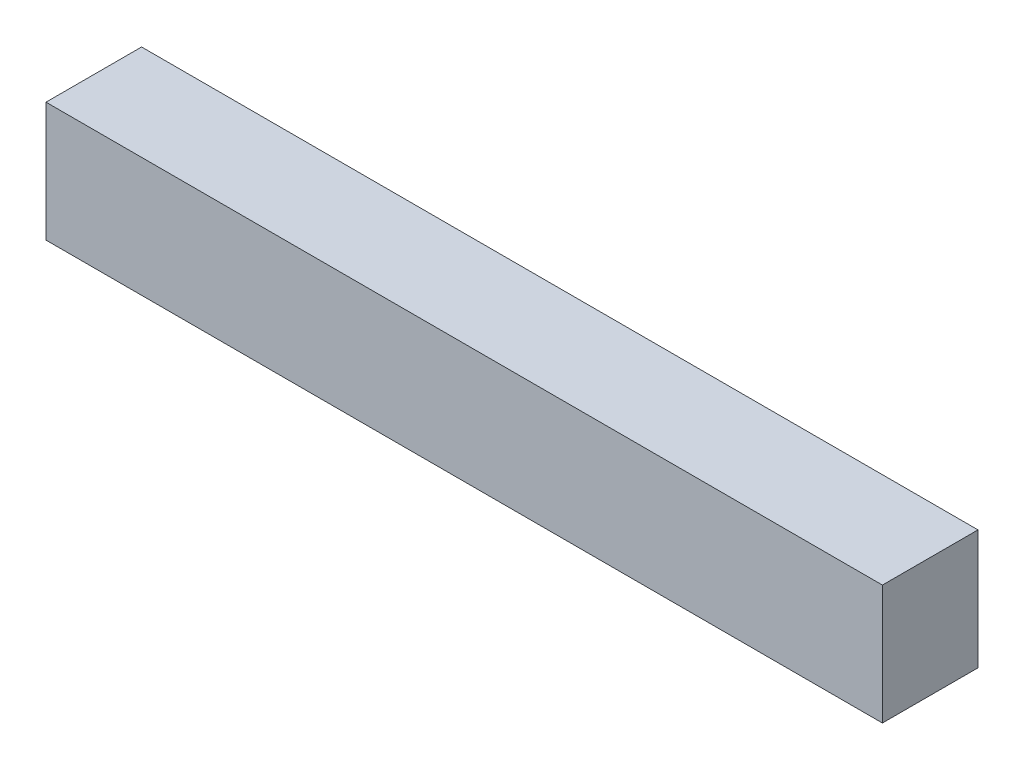
ISO-10303-21;
HEADER;
FILE_DESCRIPTION(('STEP AP214'),'2;1');
FILE_NAME('part.step','',(''),(''),'','','');
FILE_SCHEMA(('AUTOMOTIVE_DESIGN { 1 0 10303 214 1 1 1 1 }'));
ENDSEC;
DATA;
#1=APPLICATION_CONTEXT('core data for automotive mechanical design processes');
#2=APPLICATION_PROTOCOL_DEFINITION('international standard','automotive_design',2000,#1);
#3=PRODUCT_CONTEXT('',#1,'mechanical');
#4=PRODUCT('Part','Part','',(#3));
#5=PRODUCT_RELATED_PRODUCT_CATEGORY('part','',(#4));
#6=PRODUCT_DEFINITION_FORMATION('','',#4);
#7=PRODUCT_DEFINITION_CONTEXT('part definition',#1,'design');
#8=PRODUCT_DEFINITION('design','',#6,#7);
#9=PRODUCT_DEFINITION_SHAPE('','',#8);
#10=(LENGTH_UNIT() NAMED_UNIT(*) SI_UNIT(.MILLI.,.METRE.));
#11=(NAMED_UNIT(*) PLANE_ANGLE_UNIT() SI_UNIT($,.RADIAN.));
#12=(NAMED_UNIT(*) SI_UNIT($,.STERADIAN.) SOLID_ANGLE_UNIT());
#13=UNCERTAINTY_MEASURE_WITH_UNIT(LENGTH_MEASURE(1.E-05),#10,'distance_accuracy_value','');
#14=(GEOMETRIC_REPRESENTATION_CONTEXT(3) GLOBAL_UNCERTAINTY_ASSIGNED_CONTEXT((#13)) GLOBAL_UNIT_ASSIGNED_CONTEXT((#10,
#11,#12)) REPRESENTATION_CONTEXT('',''));
#15=CARTESIAN_POINT('',(0.,0.,0.));
#16=DIRECTION('',(0.,0.,1.));
#17=DIRECTION('',(1.,0.,0.));
#18=AXIS2_PLACEMENT_3D('',#15,#16,#17);
#19=CARTESIAN_POINT('',(17.5,5.,2.));
#20=DIRECTION('',(-1.,0.,0.));
#21=DIRECTION('',(0.,0.,1.));
#22=AXIS2_PLACEMENT_3D('',#19,#20,#21);
#23=PLANE('',#22);
#24=DIRECTION('',(0.,0.,-1.));
#25=VECTOR('',#24,1.);
#26=CARTESIAN_POINT('',(17.5,0.,2.));
#27=LINE('',#26,#25);
#28=CARTESIAN_POINT('',(17.5,0.,2.));
#29=VERTEX_POINT('',#28);
#30=CARTESIAN_POINT('',(17.5,0.,-2.));
#31=VERTEX_POINT('',#30);
#32=EDGE_CURVE('E98',#29,#31,#27,.T.);
#33=ORIENTED_EDGE('',*,*,#32,.T.);
#34=DIRECTION('',(0.,-1.,0.));
#35=VECTOR('',#34,1.);
#36=CARTESIAN_POINT('',(17.5,5.,-2.));
#37=LINE('',#36,#35);
#38=CARTESIAN_POINT('',(17.5,5.,-2.));
#39=VERTEX_POINT('',#38);
#40=EDGE_CURVE('E11',#39,#31,#37,.T.);
#41=ORIENTED_EDGE('',*,*,#40,.F.);
#42=DIRECTION('',(0.,0.,-1.));
#43=VECTOR('',#42,1.);
#44=CARTESIAN_POINT('',(17.5,5.,2.));
#45=LINE('',#44,#43);
#46=CARTESIAN_POINT('',(17.5,5.,2.));
#47=VERTEX_POINT('',#46);
#48=EDGE_CURVE('E86',#47,#39,#45,.T.);
#49=ORIENTED_EDGE('',*,*,#48,.F.);
#50=DIRECTION('',(0.,-1.,0.));
#51=VECTOR('',#50,1.);
#52=CARTESIAN_POINT('',(17.5,5.,2.));
#53=LINE('',#52,#51);
#54=EDGE_CURVE('E94',#47,#29,#53,.T.);
#55=ORIENTED_EDGE('',*,*,#54,.T.);
#56=EDGE_LOOP('',(#33,#41,#49,#55));
#57=FACE_BOUND('',#56,.T.);
#58=ADVANCED_FACE('F35',(#57),#23,.F.);
#59=CARTESIAN_POINT('',(-17.5,5.,-2.));
#60=DIRECTION('',(0.,0.,1.));
#61=DIRECTION('',(1.,0.,0.));
#62=AXIS2_PLACEMENT_3D('',#59,#60,#61);
#63=PLANE('',#62);
#64=DIRECTION('',(-1.,0.,0.));
#65=VECTOR('',#64,1.);
#66=CARTESIAN_POINT('',(-17.5,0.,-2.));
#67=LINE('',#66,#65);
#68=CARTESIAN_POINT('',(-17.5,0.,-2.));
#69=VERTEX_POINT('',#68);
#70=EDGE_CURVE('E90',#31,#69,#67,.T.);
#71=ORIENTED_EDGE('',*,*,#70,.T.);
#72=DIRECTION('',(0.,-1.,0.));
#73=VECTOR('',#72,1.);
#74=CARTESIAN_POINT('',(-17.5,5.,-2.));
#75=LINE('',#74,#73);
#76=CARTESIAN_POINT('',(-17.5,5.,-2.));
#77=VERTEX_POINT('',#76);
#78=EDGE_CURVE('E43',#77,#69,#75,.T.);
#79=ORIENTED_EDGE('',*,*,#78,.F.);
#80=DIRECTION('',(-1.,0.,0.));
#81=VECTOR('',#80,1.);
#82=CARTESIAN_POINT('',(-17.5,5.,-2.));
#83=LINE('',#82,#81);
#84=EDGE_CURVE('E81',#39,#77,#83,.T.);
#85=ORIENTED_EDGE('',*,*,#84,.F.);
#86=ORIENTED_EDGE('',*,*,#40,.T.);
#87=EDGE_LOOP('',(#71,#79,#85,#86));
#88=FACE_BOUND('',#87,.T.);
#89=ADVANCED_FACE('F89',(#88),#63,.F.);
#90=CARTESIAN_POINT('',(-17.5,5.,2.));
#91=DIRECTION('',(1.,0.,0.));
#92=DIRECTION('',(0.,0.,-1.));
#93=AXIS2_PLACEMENT_3D('',#90,#91,#92);
#94=PLANE('',#93);
#95=DIRECTION('',(0.,0.,1.));
#96=VECTOR('',#95,1.);
#97=CARTESIAN_POINT('',(-17.5,0.,2.));
#98=LINE('',#97,#96);
#99=CARTESIAN_POINT('',(-17.5,0.,2.));
#100=VERTEX_POINT('',#99);
#101=EDGE_CURVE('E68',#69,#100,#98,.T.);
#102=ORIENTED_EDGE('',*,*,#101,.T.);
#103=DIRECTION('',(0.,-1.,0.));
#104=VECTOR('',#103,1.);
#105=CARTESIAN_POINT('',(-17.5,5.,2.));
#106=LINE('',#105,#104);
#107=CARTESIAN_POINT('',(-17.5,5.,2.));
#108=VERTEX_POINT('',#107);
#109=EDGE_CURVE('E91',#108,#100,#106,.T.);
#110=ORIENTED_EDGE('',*,*,#109,.F.);
#111=DIRECTION('',(0.,0.,1.));
#112=VECTOR('',#111,1.);
#113=CARTESIAN_POINT('',(-17.5,5.,2.));
#114=LINE('',#113,#112);
#115=EDGE_CURVE('E84',#77,#108,#114,.T.);
#116=ORIENTED_EDGE('',*,*,#115,.F.);
#117=ORIENTED_EDGE('',*,*,#78,.T.);
#118=EDGE_LOOP('',(#102,#110,#116,#117));
#119=FACE_BOUND('',#118,.T.);
#120=ADVANCED_FACE('F92',(#119),#94,.F.);
#121=CARTESIAN_POINT('',(-17.5,5.,2.));
#122=DIRECTION('',(0.,0.,-1.));
#123=DIRECTION('',(-1.,0.,0.));
#124=AXIS2_PLACEMENT_3D('',#121,#122,#123);
#125=PLANE('',#124);
#126=DIRECTION('',(1.,0.,0.));
#127=VECTOR('',#126,1.);
#128=CARTESIAN_POINT('',(-17.5,0.,2.));
#129=LINE('',#128,#127);
#130=EDGE_CURVE('E74',#100,#29,#129,.T.);
#131=ORIENTED_EDGE('',*,*,#130,.T.);
#132=ORIENTED_EDGE('',*,*,#54,.F.);
#133=DIRECTION('',(1.,0.,0.));
#134=VECTOR('',#133,1.);
#135=CARTESIAN_POINT('',(-17.5,5.,2.));
#136=LINE('',#135,#134);
#137=EDGE_CURVE('E51',#108,#47,#136,.T.);
#138=ORIENTED_EDGE('',*,*,#137,.F.);
#139=ORIENTED_EDGE('',*,*,#109,.T.);
#140=EDGE_LOOP('',(#131,#132,#138,#139));
#141=FACE_BOUND('',#140,.T.);
#142=ADVANCED_FACE('F105',(#141),#125,.F.);
#143=CARTESIAN_POINT('',(0.,5.,0.));
#144=DIRECTION('',(0.,-1.,0.));
#145=DIRECTION('',(0.,0.,-1.));
#146=AXIS2_PLACEMENT_3D('',#143,#144,#145);
#147=PLANE('',#146);
#148=ORIENTED_EDGE('',*,*,#48,.T.);
#149=ORIENTED_EDGE('',*,*,#84,.T.);
#150=ORIENTED_EDGE('',*,*,#115,.T.);
#151=ORIENTED_EDGE('',*,*,#137,.T.);
#152=EDGE_LOOP('',(#148,#149,#150,#151));
#153=FACE_BOUND('',#152,.T.);
#154=ADVANCED_FACE('F82',(#153),#147,.F.);
#155=CARTESIAN_POINT('',(0.,0.,0.));
#156=DIRECTION('',(0.,-1.,0.));
#157=DIRECTION('',(0.,0.,-1.));
#158=AXIS2_PLACEMENT_3D('',#155,#156,#157);
#159=PLANE('',#158);
#160=ORIENTED_EDGE('',*,*,#32,.F.);
#161=ORIENTED_EDGE('',*,*,#130,.F.);
#162=ORIENTED_EDGE('',*,*,#101,.F.);
#163=ORIENTED_EDGE('',*,*,#70,.F.);
#164=EDGE_LOOP('',(#160,#161,#162,#163));
#165=FACE_BOUND('',#164,.T.);
#166=ADVANCED_FACE('F108',(#165),#159,.T.);
#167=CLOSED_SHELL('',(#58,#89,#120,#142,#154,#166));
#168=MANIFOLD_SOLID_BREP('B2',#167);
#169=ADVANCED_BREP_SHAPE_REPRESENTATION('',(#18,#168),#14);
#170=SHAPE_DEFINITION_REPRESENTATION(#9,#169);
ENDSEC;
END-ISO-10303-21;
